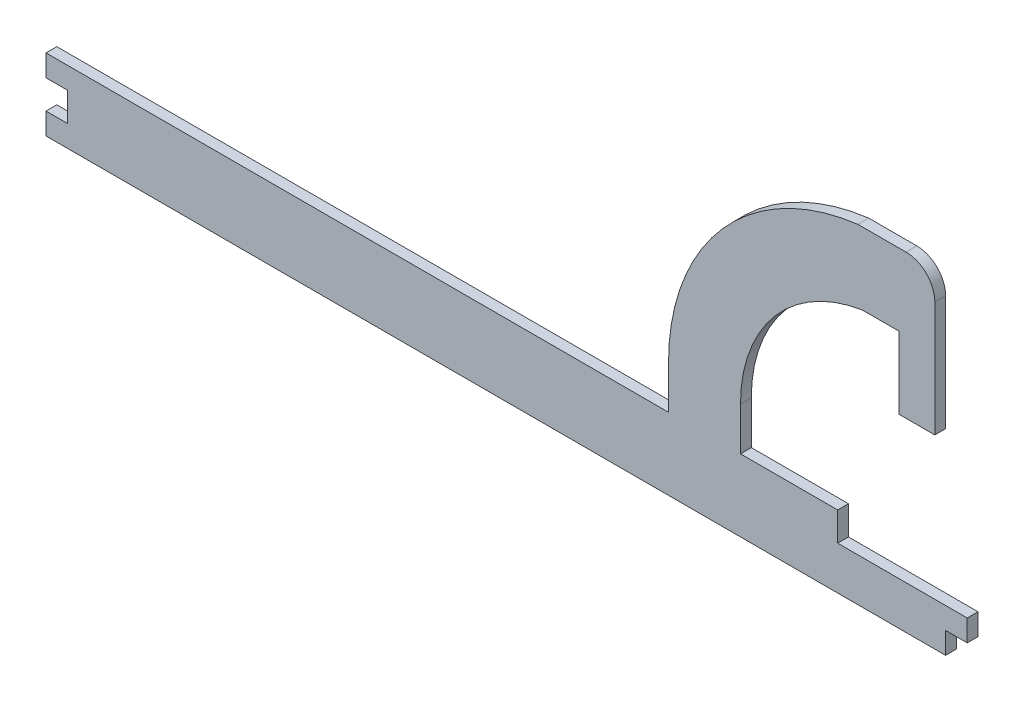
ISO-10303-21;
HEADER;
FILE_DESCRIPTION(('STEP AP214'),'2;1');
FILE_NAME('part.step','',(''),(''),'','','');
FILE_SCHEMA(('AUTOMOTIVE_DESIGN { 1 0 10303 214 1 1 1 1 }'));
ENDSEC;
DATA;
#1=APPLICATION_CONTEXT('core data for automotive mechanical design processes');
#2=APPLICATION_PROTOCOL_DEFINITION('international standard','automotive_design',2000,#1);
#3=PRODUCT_CONTEXT('',#1,'mechanical');
#4=PRODUCT('Part','Part','',(#3));
#5=PRODUCT_RELATED_PRODUCT_CATEGORY('part','',(#4));
#6=PRODUCT_DEFINITION_FORMATION('','',#4);
#7=PRODUCT_DEFINITION_CONTEXT('part definition',#1,'design');
#8=PRODUCT_DEFINITION('design','',#6,#7);
#9=PRODUCT_DEFINITION_SHAPE('','',#8);
#10=(LENGTH_UNIT() NAMED_UNIT(*) SI_UNIT(.MILLI.,.METRE.));
#11=(NAMED_UNIT(*) PLANE_ANGLE_UNIT() SI_UNIT($,.RADIAN.));
#12=(NAMED_UNIT(*) SI_UNIT($,.STERADIAN.) SOLID_ANGLE_UNIT());
#13=UNCERTAINTY_MEASURE_WITH_UNIT(LENGTH_MEASURE(1.E-05),#10,'distance_accuracy_value','');
#14=(GEOMETRIC_REPRESENTATION_CONTEXT(3) GLOBAL_UNCERTAINTY_ASSIGNED_CONTEXT((#13)) GLOBAL_UNIT_ASSIGNED_CONTEXT((#10,
#11,#12)) REPRESENTATION_CONTEXT('',''));
#15=CARTESIAN_POINT('',(0.,0.,0.));
#16=DIRECTION('',(0.,0.,1.));
#17=DIRECTION('',(1.,0.,0.));
#18=AXIS2_PLACEMENT_3D('',#15,#16,#17);
#19=CARTESIAN_POINT('',(0.,0.,3.));
#20=DIRECTION('',(0.,1.,0.));
#21=DIRECTION('',(0.,0.,1.));
#22=AXIS2_PLACEMENT_3D('',#19,#20,#21);
#23=PLANE('',#22);
#24=DIRECTION('',(1.,0.,0.));
#25=VECTOR('',#24,1.);
#26=CARTESIAN_POINT('',(0.,0.,0.));
#27=LINE('',#26,#25);
#28=CARTESIAN_POINT('',(-6.,0.,0.));
#29=VERTEX_POINT('',#28);
#30=CARTESIAN_POINT('',(244.,0.,0.));
#31=VERTEX_POINT('',#30);
#32=EDGE_CURVE('E130',#29,#31,#27,.T.);
#33=ORIENTED_EDGE('',*,*,#32,.T.);
#34=DIRECTION('',(0.,0.,-1.));
#35=VECTOR('',#34,1.);
#36=CARTESIAN_POINT('',(244.,0.,3.));
#37=LINE('',#36,#35);
#38=CARTESIAN_POINT('',(244.,0.,3.));
#39=VERTEX_POINT('',#38);
#40=EDGE_CURVE('E11',#39,#31,#37,.T.);
#41=ORIENTED_EDGE('',*,*,#40,.F.);
#42=DIRECTION('',(1.,0.,0.));
#43=VECTOR('',#42,1.);
#44=CARTESIAN_POINT('',(-6.,0.,3.));
#45=LINE('',#44,#43);
#46=CARTESIAN_POINT('',(-6.,0.,3.));
#47=VERTEX_POINT('',#46);
#48=EDGE_CURVE('E136',#47,#39,#45,.T.);
#49=ORIENTED_EDGE('',*,*,#48,.F.);
#50=DIRECTION('',(0.,0.,-1.));
#51=VECTOR('',#50,1.);
#52=CARTESIAN_POINT('',(-6.,0.,3.));
#53=LINE('',#52,#51);
#54=EDGE_CURVE('E215',#47,#29,#53,.T.);
#55=ORIENTED_EDGE('',*,*,#54,.T.);
#56=EDGE_LOOP('',(#33,#41,#49,#55));
#57=FACE_BOUND('',#56,.T.);
#58=ADVANCED_FACE('F33',(#57),#23,.F.);
#59=CARTESIAN_POINT('',(244.,6.,3.));
#60=DIRECTION('',(-1.,0.,0.));
#61=DIRECTION('',(0.,0.,1.));
#62=AXIS2_PLACEMENT_3D('',#59,#60,#61);
#63=PLANE('',#62);
#64=DIRECTION('',(0.,1.,0.));
#65=VECTOR('',#64,1.);
#66=CARTESIAN_POINT('',(244.,6.,0.));
#67=LINE('',#66,#65);
#68=CARTESIAN_POINT('',(244.,6.,0.));
#69=VERTEX_POINT('',#68);
#70=EDGE_CURVE('E220',#31,#69,#67,.T.);
#71=ORIENTED_EDGE('',*,*,#70,.T.);
#72=DIRECTION('',(0.,0.,-1.));
#73=VECTOR('',#72,1.);
#74=CARTESIAN_POINT('',(244.,6.,3.));
#75=LINE('',#74,#73);
#76=CARTESIAN_POINT('',(244.,6.,3.));
#77=VERTEX_POINT('',#76);
#78=EDGE_CURVE('E41',#77,#69,#75,.T.);
#79=ORIENTED_EDGE('',*,*,#78,.F.);
#80=DIRECTION('',(0.,1.,0.));
#81=VECTOR('',#80,1.);
#82=CARTESIAN_POINT('',(244.,6.,3.));
#83=LINE('',#82,#81);
#84=EDGE_CURVE('E386',#39,#77,#83,.T.);
#85=ORIENTED_EDGE('',*,*,#84,.F.);
#86=ORIENTED_EDGE('',*,*,#40,.T.);
#87=EDGE_LOOP('',(#71,#79,#85,#86));
#88=FACE_BOUND('',#87,.T.);
#89=ADVANCED_FACE('F389',(#88),#63,.F.);
#90=CARTESIAN_POINT('',(250.,6.,3.));
#91=DIRECTION('',(0.,1.,0.));
#92=DIRECTION('',(-1.,0.,0.));
#93=AXIS2_PLACEMENT_3D('',#90,#91,#92);
#94=PLANE('',#93);
#95=DIRECTION('',(1.,0.,0.));
#96=VECTOR('',#95,1.);
#97=CARTESIAN_POINT('',(250.,6.,0.));
#98=LINE('',#97,#96);
#99=CARTESIAN_POINT('',(250.,6.,0.));
#100=VERTEX_POINT('',#99);
#101=EDGE_CURVE('E222',#69,#100,#98,.T.);
#102=ORIENTED_EDGE('',*,*,#101,.T.);
#103=DIRECTION('',(0.,0.,-1.));
#104=VECTOR('',#103,1.);
#105=CARTESIAN_POINT('',(250.,6.,3.));
#106=LINE('',#105,#104);
#107=CARTESIAN_POINT('',(250.,6.,3.));
#108=VERTEX_POINT('',#107);
#109=EDGE_CURVE('E316',#108,#100,#106,.T.);
#110=ORIENTED_EDGE('',*,*,#109,.F.);
#111=DIRECTION('',(1.,0.,0.));
#112=VECTOR('',#111,1.);
#113=CARTESIAN_POINT('',(250.,6.,3.));
#114=LINE('',#113,#112);
#115=EDGE_CURVE('E325',#77,#108,#114,.T.);
#116=ORIENTED_EDGE('',*,*,#115,.F.);
#117=ORIENTED_EDGE('',*,*,#78,.T.);
#118=EDGE_LOOP('',(#102,#110,#116,#117));
#119=FACE_BOUND('',#118,.T.);
#120=ADVANCED_FACE('F323',(#119),#94,.F.);
#121=CARTESIAN_POINT('',(250.,12.,3.));
#122=DIRECTION('',(-1.,0.,0.));
#123=DIRECTION('',(0.,0.,1.));
#124=AXIS2_PLACEMENT_3D('',#121,#122,#123);
#125=PLANE('',#124);
#126=DIRECTION('',(0.,1.,0.));
#127=VECTOR('',#126,1.);
#128=CARTESIAN_POINT('',(250.,12.,0.));
#129=LINE('',#128,#127);
#130=CARTESIAN_POINT('',(250.,12.,0.));
#131=VERTEX_POINT('',#130);
#132=EDGE_CURVE('E224',#100,#131,#129,.T.);
#133=ORIENTED_EDGE('',*,*,#132,.T.);
#134=DIRECTION('',(0.,0.,-1.));
#135=VECTOR('',#134,1.);
#136=CARTESIAN_POINT('',(250.,12.,3.));
#137=LINE('',#136,#135);
#138=CARTESIAN_POINT('',(250.,12.,3.));
#139=VERTEX_POINT('',#138);
#140=EDGE_CURVE('E313',#139,#131,#137,.T.);
#141=ORIENTED_EDGE('',*,*,#140,.F.);
#142=DIRECTION('',(0.,1.,0.));
#143=VECTOR('',#142,1.);
#144=CARTESIAN_POINT('',(250.,12.,3.));
#145=LINE('',#144,#143);
#146=EDGE_CURVE('E342',#108,#139,#145,.T.);
#147=ORIENTED_EDGE('',*,*,#146,.F.);
#148=ORIENTED_EDGE('',*,*,#109,.T.);
#149=EDGE_LOOP('',(#133,#141,#147,#148));
#150=FACE_BOUND('',#149,.T.);
#151=ADVANCED_FACE('F333',(#150),#125,.F.);
#152=CARTESIAN_POINT('',(214.,12.,3.));
#153=DIRECTION('',(0.,-1.,0.));
#154=DIRECTION('',(0.,0.,-1.));
#155=AXIS2_PLACEMENT_3D('',#152,#153,#154);
#156=PLANE('',#155);
#157=DIRECTION('',(-1.,0.,0.));
#158=VECTOR('',#157,1.);
#159=CARTESIAN_POINT('',(214.,12.,0.));
#160=LINE('',#159,#158);
#161=CARTESIAN_POINT('',(214.,12.,0.));
#162=VERTEX_POINT('',#161);
#163=EDGE_CURVE('E227',#131,#162,#160,.T.);
#164=ORIENTED_EDGE('',*,*,#163,.T.);
#165=DIRECTION('',(0.,0.,-1.));
#166=VECTOR('',#165,1.);
#167=CARTESIAN_POINT('',(214.,12.,3.));
#168=LINE('',#167,#166);
#169=CARTESIAN_POINT('',(214.,12.,3.));
#170=VERTEX_POINT('',#169);
#171=EDGE_CURVE('E310',#170,#162,#168,.T.);
#172=ORIENTED_EDGE('',*,*,#171,.F.);
#173=DIRECTION('',(-1.,0.,0.));
#174=VECTOR('',#173,1.);
#175=CARTESIAN_POINT('',(244.,12.,3.));
#176=LINE('',#175,#174);
#177=EDGE_CURVE('E339',#139,#170,#176,.T.);
#178=ORIENTED_EDGE('',*,*,#177,.F.);
#179=ORIENTED_EDGE('',*,*,#140,.T.);
#180=EDGE_LOOP('',(#164,#172,#178,#179));
#181=FACE_BOUND('',#180,.T.);
#182=ADVANCED_FACE('F337',(#181),#156,.F.);
#183=CARTESIAN_POINT('',(214.,20.,3.));
#184=DIRECTION('',(-1.,0.,0.));
#185=DIRECTION('',(0.,0.,1.));
#186=AXIS2_PLACEMENT_3D('',#183,#184,#185);
#187=PLANE('',#186);
#188=DIRECTION('',(0.,1.,0.));
#189=VECTOR('',#188,1.);
#190=CARTESIAN_POINT('',(214.,20.,0.));
#191=LINE('',#190,#189);
#192=CARTESIAN_POINT('',(214.,20.,0.));
#193=VERTEX_POINT('',#192);
#194=EDGE_CURVE('E229',#162,#193,#191,.T.);
#195=ORIENTED_EDGE('',*,*,#194,.T.);
#196=DIRECTION('',(0.,0.,-1.));
#197=VECTOR('',#196,1.);
#198=CARTESIAN_POINT('',(214.,20.,3.));
#199=LINE('',#198,#197);
#200=CARTESIAN_POINT('',(214.,20.,3.));
#201=VERTEX_POINT('',#200);
#202=EDGE_CURVE('E307',#201,#193,#199,.T.);
#203=ORIENTED_EDGE('',*,*,#202,.F.);
#204=DIRECTION('',(0.,1.,0.));
#205=VECTOR('',#204,1.);
#206=CARTESIAN_POINT('',(214.,20.,3.));
#207=LINE('',#206,#205);
#208=EDGE_CURVE('E341',#170,#201,#207,.T.);
#209=ORIENTED_EDGE('',*,*,#208,.F.);
#210=ORIENTED_EDGE('',*,*,#171,.T.);
#211=EDGE_LOOP('',(#195,#203,#209,#210));
#212=FACE_BOUND('',#211,.T.);
#213=ADVANCED_FACE('F401',(#212),#187,.F.);
#214=CARTESIAN_POINT('',(187.,20.,3.));
#215=DIRECTION('',(0.,-1.,0.));
#216=DIRECTION('',(0.,0.,-1.));
#217=AXIS2_PLACEMENT_3D('',#214,#215,#216);
#218=PLANE('',#217);
#219=DIRECTION('',(-1.,0.,0.));
#220=VECTOR('',#219,1.);
#221=CARTESIAN_POINT('',(187.,20.,0.));
#222=LINE('',#221,#220);
#223=CARTESIAN_POINT('',(187.,20.,0.));
#224=VERTEX_POINT('',#223);
#225=EDGE_CURVE('E231',#193,#224,#222,.T.);
#226=ORIENTED_EDGE('',*,*,#225,.T.);
#227=DIRECTION('',(0.,0.,-1.));
#228=VECTOR('',#227,1.);
#229=CARTESIAN_POINT('',(187.,20.,3.));
#230=LINE('',#229,#228);
#231=CARTESIAN_POINT('',(187.,20.,3.));
#232=VERTEX_POINT('',#231);
#233=EDGE_CURVE('E304',#232,#224,#230,.T.);
#234=ORIENTED_EDGE('',*,*,#233,.F.);
#235=DIRECTION('',(-1.,0.,0.));
#236=VECTOR('',#235,1.);
#237=CARTESIAN_POINT('',(187.,20.,3.));
#238=LINE('',#237,#236);
#239=EDGE_CURVE('E344',#201,#232,#238,.T.);
#240=ORIENTED_EDGE('',*,*,#239,.F.);
#241=ORIENTED_EDGE('',*,*,#202,.T.);
#242=EDGE_LOOP('',(#226,#234,#240,#241));
#243=FACE_BOUND('',#242,.T.);
#244=ADVANCED_FACE('F404',(#243),#218,.F.);
#245=CARTESIAN_POINT('',(187.,20.,3.));
#246=DIRECTION('',(-1.,0.,0.));
#247=DIRECTION('',(0.,0.,1.));
#248=AXIS2_PLACEMENT_3D('',#245,#246,#247);
#249=PLANE('',#248);
#250=DIRECTION('',(0.,1.,0.));
#251=VECTOR('',#250,1.);
#252=CARTESIAN_POINT('',(187.,20.,0.));
#253=LINE('',#252,#251);
#254=CARTESIAN_POINT('',(187.,32.,0.));
#255=VERTEX_POINT('',#254);
#256=EDGE_CURVE('E233',#224,#255,#253,.T.);
#257=ORIENTED_EDGE('',*,*,#256,.T.);
#258=DIRECTION('',(0.,0.,-1.));
#259=VECTOR('',#258,1.);
#260=CARTESIAN_POINT('',(187.,32.,3.));
#261=LINE('',#260,#259);
#262=CARTESIAN_POINT('',(187.,32.,3.));
#263=VERTEX_POINT('',#262);
#264=EDGE_CURVE('E301',#263,#255,#261,.T.);
#265=ORIENTED_EDGE('',*,*,#264,.F.);
#266=DIRECTION('',(0.,1.,0.));
#267=VECTOR('',#266,1.);
#268=CARTESIAN_POINT('',(187.,20.,3.));
#269=LINE('',#268,#267);
#270=EDGE_CURVE('E350',#232,#263,#269,.T.);
#271=ORIENTED_EDGE('',*,*,#270,.F.);
#272=ORIENTED_EDGE('',*,*,#233,.T.);
#273=EDGE_LOOP('',(#257,#265,#271,#272));
#274=FACE_BOUND('',#273,.T.);
#275=ADVANCED_FACE('F408',(#274),#249,.F.);
#276=CARTESIAN_POINT('',(227.,32.,3.));
#277=DIRECTION('',(0.,0.,-1.));
#278=DIRECTION('',(-1.,0.,0.));
#279=AXIS2_PLACEMENT_3D('',#276,#277,#278);
#280=CYLINDRICAL_SURFACE('',#279,40.);
#281=CARTESIAN_POINT('',(227.,32.,0.));
#282=DIRECTION('',(0.,0.,-1.));
#283=DIRECTION('',(1.,0.,0.));
#284=AXIS2_PLACEMENT_3D('',#281,#282,#283);
#285=CIRCLE('',#284,40.);
#286=CARTESIAN_POINT('',(221.,71.5474398665704,0.));
#287=VERTEX_POINT('',#286);
#288=EDGE_CURVE('E235',#255,#287,#285,.T.);
#289=ORIENTED_EDGE('',*,*,#288,.T.);
#290=DIRECTION('',(0.,0.,-1.));
#291=VECTOR('',#290,1.);
#292=CARTESIAN_POINT('',(221.,71.5474398665704,3.));
#293=LINE('',#292,#291);
#294=CARTESIAN_POINT('',(221.,71.5474398665704,3.));
#295=VERTEX_POINT('',#294);
#296=EDGE_CURVE('E298',#295,#287,#293,.T.);
#297=ORIENTED_EDGE('',*,*,#296,.F.);
#298=CARTESIAN_POINT('',(227.,32.,3.));
#299=DIRECTION('',(0.,0.,-1.));
#300=DIRECTION('',(1.,0.,0.));
#301=AXIS2_PLACEMENT_3D('',#298,#299,#300);
#302=CIRCLE('',#301,40.);
#303=EDGE_CURVE('E352',#263,#295,#302,.T.);
#304=ORIENTED_EDGE('',*,*,#303,.F.);
#305=ORIENTED_EDGE('',*,*,#264,.T.);
#306=EDGE_LOOP('',(#289,#297,#304,#305));
#307=FACE_BOUND('',#306,.T.);
#308=ADVANCED_FACE('F412',(#307),#280,.F.);
#309=CARTESIAN_POINT('',(231.,71.5474398665704,3.));
#310=DIRECTION('',(0.,1.,0.));
#311=DIRECTION('',(0.,0.,1.));
#312=AXIS2_PLACEMENT_3D('',#309,#310,#311);
#313=PLANE('',#312);
#314=DIRECTION('',(1.,0.,0.));
#315=VECTOR('',#314,1.);
#316=CARTESIAN_POINT('',(231.,71.5474398665704,0.));
#317=LINE('',#316,#315);
#318=CARTESIAN_POINT('',(231.,71.5474398665704,0.));
#319=VERTEX_POINT('',#318);
#320=EDGE_CURVE('E237',#287,#319,#317,.T.);
#321=ORIENTED_EDGE('',*,*,#320,.T.);
#322=DIRECTION('',(0.,0.,-1.));
#323=VECTOR('',#322,1.);
#324=CARTESIAN_POINT('',(231.,71.5474398665704,3.));
#325=LINE('',#324,#323);
#326=CARTESIAN_POINT('',(231.,71.5474398665704,3.));
#327=VERTEX_POINT('',#326);
#328=EDGE_CURVE('E295',#327,#319,#325,.T.);
#329=ORIENTED_EDGE('',*,*,#328,.F.);
#330=DIRECTION('',(1.,0.,0.));
#331=VECTOR('',#330,1.);
#332=CARTESIAN_POINT('',(231.,71.5474398665704,3.));
#333=LINE('',#332,#331);
#334=EDGE_CURVE('E354',#295,#327,#333,.T.);
#335=ORIENTED_EDGE('',*,*,#334,.F.);
#336=ORIENTED_EDGE('',*,*,#296,.T.);
#337=EDGE_LOOP('',(#321,#329,#335,#336));
#338=FACE_BOUND('',#337,.T.);
#339=ADVANCED_FACE('F416',(#338),#313,.F.);
#340=CARTESIAN_POINT('',(231.,71.5474398665704,3.));
#341=DIRECTION('',(1.,0.,0.));
#342=DIRECTION('',(0.,0.,-1.));
#343=AXIS2_PLACEMENT_3D('',#340,#341,#342);
#344=PLANE('',#343);
#345=DIRECTION('',(0.,-1.,0.));
#346=VECTOR('',#345,1.);
#347=CARTESIAN_POINT('',(231.,71.5474398665704,0.));
#348=LINE('',#347,#346);
#349=CARTESIAN_POINT('',(231.,51.5474398665704,0.));
#350=VERTEX_POINT('',#349);
#351=EDGE_CURVE('E239',#319,#350,#348,.T.);
#352=ORIENTED_EDGE('',*,*,#351,.T.);
#353=DIRECTION('',(0.,0.,-1.));
#354=VECTOR('',#353,1.);
#355=CARTESIAN_POINT('',(231.,51.5474398665704,3.));
#356=LINE('',#355,#354);
#357=CARTESIAN_POINT('',(231.,51.5474398665704,3.));
#358=VERTEX_POINT('',#357);
#359=EDGE_CURVE('E292',#358,#350,#356,.T.);
#360=ORIENTED_EDGE('',*,*,#359,.F.);
#361=DIRECTION('',(0.,-1.,0.));
#362=VECTOR('',#361,1.);
#363=CARTESIAN_POINT('',(231.,71.5474398665704,3.));
#364=LINE('',#363,#362);
#365=EDGE_CURVE('E356',#327,#358,#364,.T.);
#366=ORIENTED_EDGE('',*,*,#365,.F.);
#367=ORIENTED_EDGE('',*,*,#328,.T.);
#368=EDGE_LOOP('',(#352,#360,#366,#367));
#369=FACE_BOUND('',#368,.T.);
#370=ADVANCED_FACE('F420',(#369),#344,.F.);
#371=CARTESIAN_POINT('',(231.,51.5474398665704,3.));
#372=DIRECTION('',(0.,1.,0.));
#373=DIRECTION('',(0.,0.,1.));
#374=AXIS2_PLACEMENT_3D('',#371,#372,#373);
#375=PLANE('',#374);
#376=DIRECTION('',(1.,0.,0.));
#377=VECTOR('',#376,1.);
#378=CARTESIAN_POINT('',(231.,51.5474398665704,0.));
#379=LINE('',#378,#377);
#380=CARTESIAN_POINT('',(241.,51.5474398665704,0.));
#381=VERTEX_POINT('',#380);
#382=EDGE_CURVE('E241',#350,#381,#379,.T.);
#383=ORIENTED_EDGE('',*,*,#382,.T.);
#384=DIRECTION('',(0.,0.,-1.));
#385=VECTOR('',#384,1.);
#386=CARTESIAN_POINT('',(241.,51.5474398665704,3.));
#387=LINE('',#386,#385);
#388=CARTESIAN_POINT('',(241.,51.5474398665704,3.));
#389=VERTEX_POINT('',#388);
#390=EDGE_CURVE('E289',#389,#381,#387,.T.);
#391=ORIENTED_EDGE('',*,*,#390,.F.);
#392=DIRECTION('',(1.,0.,0.));
#393=VECTOR('',#392,1.);
#394=CARTESIAN_POINT('',(231.,51.5474398665704,3.));
#395=LINE('',#394,#393);
#396=EDGE_CURVE('E358',#358,#389,#395,.T.);
#397=ORIENTED_EDGE('',*,*,#396,.F.);
#398=ORIENTED_EDGE('',*,*,#359,.T.);
#399=EDGE_LOOP('',(#383,#391,#397,#398));
#400=FACE_BOUND('',#399,.T.);
#401=ADVANCED_FACE('F424',(#400),#375,.F.);
#402=CARTESIAN_POINT('',(241.,83.5474398665704,3.));
#403=DIRECTION('',(-1.,0.,0.));
#404=DIRECTION('',(0.,0.,1.));
#405=AXIS2_PLACEMENT_3D('',#402,#403,#404);
#406=PLANE('',#405);
#407=DIRECTION('',(0.,1.,0.));
#408=VECTOR('',#407,1.);
#409=CARTESIAN_POINT('',(241.,83.5474398665704,0.));
#410=LINE('',#409,#408);
#411=CARTESIAN_POINT('',(241.,83.5474398665704,0.));
#412=VERTEX_POINT('',#411);
#413=EDGE_CURVE('E243',#381,#412,#410,.T.);
#414=ORIENTED_EDGE('',*,*,#413,.T.);
#415=DIRECTION('',(0.,0.,-1.));
#416=VECTOR('',#415,1.);
#417=CARTESIAN_POINT('',(241.,83.5474398665704,3.));
#418=LINE('',#417,#416);
#419=CARTESIAN_POINT('',(241.,83.5474398665704,3.));
#420=VERTEX_POINT('',#419);
#421=EDGE_CURVE('E286',#420,#412,#418,.T.);
#422=ORIENTED_EDGE('',*,*,#421,.F.);
#423=DIRECTION('',(0.,1.,0.));
#424=VECTOR('',#423,1.);
#425=CARTESIAN_POINT('',(241.,83.5474398665704,3.));
#426=LINE('',#425,#424);
#427=EDGE_CURVE('E360',#389,#420,#426,.T.);
#428=ORIENTED_EDGE('',*,*,#427,.F.);
#429=ORIENTED_EDGE('',*,*,#390,.T.);
#430=EDGE_LOOP('',(#414,#422,#428,#429));
#431=FACE_BOUND('',#430,.T.);
#432=ADVANCED_FACE('F428',(#431),#406,.F.);
#433=CARTESIAN_POINT('',(233.,83.5474398665704,3.));
#434=DIRECTION('',(0.,0.,-1.));
#435=DIRECTION('',(-1.,0.,0.));
#436=AXIS2_PLACEMENT_3D('',#433,#434,#435);
#437=CYLINDRICAL_SURFACE('',#436,8.00000000000001);
#438=CARTESIAN_POINT('',(233.,83.5474398665704,0.));
#439=DIRECTION('',(0.,0.,1.));
#440=DIRECTION('',(1.,0.,0.));
#441=AXIS2_PLACEMENT_3D('',#438,#439,#440);
#442=CIRCLE('',#441,8.00000000000001);
#443=CARTESIAN_POINT('',(233.,91.5474398665704,0.));
#444=VERTEX_POINT('',#443);
#445=EDGE_CURVE('E245',#412,#444,#442,.T.);
#446=ORIENTED_EDGE('',*,*,#445,.T.);
#447=DIRECTION('',(0.,0.,-1.));
#448=VECTOR('',#447,1.);
#449=CARTESIAN_POINT('',(233.,91.5474398665704,3.));
#450=LINE('',#449,#448);
#451=CARTESIAN_POINT('',(233.,91.5474398665704,3.));
#452=VERTEX_POINT('',#451);
#453=EDGE_CURVE('E283',#452,#444,#450,.T.);
#454=ORIENTED_EDGE('',*,*,#453,.F.);
#455=CARTESIAN_POINT('',(233.,83.5474398665704,3.));
#456=DIRECTION('',(0.,0.,1.));
#457=DIRECTION('',(1.,0.,0.));
#458=AXIS2_PLACEMENT_3D('',#455,#456,#457);
#459=CIRCLE('',#458,8.00000000000001);
#460=EDGE_CURVE('E362',#420,#452,#459,.T.);
#461=ORIENTED_EDGE('',*,*,#460,.F.);
#462=ORIENTED_EDGE('',*,*,#421,.T.);
#463=EDGE_LOOP('',(#446,#454,#461,#462));
#464=FACE_BOUND('',#463,.T.);
#465=ADVANCED_FACE('F432',(#464),#437,.T.);
#466=CARTESIAN_POINT('',(233.,91.5474398665704,3.));
#467=DIRECTION('',(0.,-1.,0.));
#468=DIRECTION('',(0.,0.,-1.));
#469=AXIS2_PLACEMENT_3D('',#466,#467,#468);
#470=PLANE('',#469);
#471=DIRECTION('',(-1.,0.,0.));
#472=VECTOR('',#471,1.);
#473=CARTESIAN_POINT('',(233.,91.5474398665704,0.));
#474=LINE('',#473,#472);
#475=CARTESIAN_POINT('',(219.644566271308,91.5474398665704,0.));
#476=VERTEX_POINT('',#475);
#477=EDGE_CURVE('E247',#444,#476,#474,.T.);
#478=ORIENTED_EDGE('',*,*,#477,.T.);
#479=DIRECTION('',(0.,0.,-1.));
#480=VECTOR('',#479,1.);
#481=CARTESIAN_POINT('',(219.644566271308,91.5474398665704,3.));
#482=LINE('',#481,#480);
#483=CARTESIAN_POINT('',(219.644566271308,91.5474398665704,3.));
#484=VERTEX_POINT('',#483);
#485=EDGE_CURVE('E280',#484,#476,#482,.T.);
#486=ORIENTED_EDGE('',*,*,#485,.F.);
#487=DIRECTION('',(-1.,0.,0.));
#488=VECTOR('',#487,1.);
#489=CARTESIAN_POINT('',(233.,91.5474398665704,3.));
#490=LINE('',#489,#488);
#491=EDGE_CURVE('E364',#452,#484,#490,.T.);
#492=ORIENTED_EDGE('',*,*,#491,.F.);
#493=ORIENTED_EDGE('',*,*,#453,.T.);
#494=EDGE_LOOP('',(#478,#486,#492,#493));
#495=FACE_BOUND('',#494,.T.);
#496=ADVANCED_FACE('F436',(#495),#470,.F.);
#497=CARTESIAN_POINT('',(227.,32.,3.));
#498=DIRECTION('',(0.,0.,-1.));
#499=DIRECTION('',(-1.,0.,0.));
#500=AXIS2_PLACEMENT_3D('',#497,#498,#499);
#501=CYLINDRICAL_SURFACE('',#500,60.);
#502=CARTESIAN_POINT('',(227.,32.,0.));
#503=DIRECTION('',(0.,0.,1.));
#504=DIRECTION('',(1.,0.,0.));
#505=AXIS2_PLACEMENT_3D('',#502,#503,#504);
#506=CIRCLE('',#505,60.);
#507=CARTESIAN_POINT('',(167.,32.,0.));
#508=VERTEX_POINT('',#507);
#509=EDGE_CURVE('E249',#476,#508,#506,.T.);
#510=ORIENTED_EDGE('',*,*,#509,.T.);
#511=DIRECTION('',(0.,0.,-1.));
#512=VECTOR('',#511,1.);
#513=CARTESIAN_POINT('',(167.,32.,3.));
#514=LINE('',#513,#512);
#515=CARTESIAN_POINT('',(167.,32.,3.));
#516=VERTEX_POINT('',#515);
#517=EDGE_CURVE('E277',#516,#508,#514,.T.);
#518=ORIENTED_EDGE('',*,*,#517,.F.);
#519=CARTESIAN_POINT('',(227.,32.,3.));
#520=DIRECTION('',(0.,0.,1.));
#521=DIRECTION('',(1.,0.,0.));
#522=AXIS2_PLACEMENT_3D('',#519,#520,#521);
#523=CIRCLE('',#522,60.);
#524=EDGE_CURVE('E366',#484,#516,#523,.T.);
#525=ORIENTED_EDGE('',*,*,#524,.F.);
#526=ORIENTED_EDGE('',*,*,#485,.T.);
#527=EDGE_LOOP('',(#510,#518,#525,#526));
#528=FACE_BOUND('',#527,.T.);
#529=ADVANCED_FACE('F440',(#528),#501,.T.);
#530=CARTESIAN_POINT('',(167.,32.,3.));
#531=DIRECTION('',(1.,0.,0.));
#532=DIRECTION('',(0.,0.,-1.));
#533=AXIS2_PLACEMENT_3D('',#530,#531,#532);
#534=PLANE('',#533);
#535=DIRECTION('',(0.,-1.,0.));
#536=VECTOR('',#535,1.);
#537=CARTESIAN_POINT('',(167.,32.,0.));
#538=LINE('',#537,#536);
#539=CARTESIAN_POINT('',(167.,20.,0.));
#540=VERTEX_POINT('',#539);
#541=EDGE_CURVE('E251',#508,#540,#538,.T.);
#542=ORIENTED_EDGE('',*,*,#541,.T.);
#543=DIRECTION('',(0.,0.,-1.));
#544=VECTOR('',#543,1.);
#545=CARTESIAN_POINT('',(167.,20.,3.));
#546=LINE('',#545,#544);
#547=CARTESIAN_POINT('',(167.,20.,3.));
#548=VERTEX_POINT('',#547);
#549=EDGE_CURVE('E274',#548,#540,#546,.T.);
#550=ORIENTED_EDGE('',*,*,#549,.F.);
#551=DIRECTION('',(0.,-1.,0.));
#552=VECTOR('',#551,1.);
#553=CARTESIAN_POINT('',(167.,32.,3.));
#554=LINE('',#553,#552);
#555=EDGE_CURVE('E368',#516,#548,#554,.T.);
#556=ORIENTED_EDGE('',*,*,#555,.F.);
#557=ORIENTED_EDGE('',*,*,#517,.T.);
#558=EDGE_LOOP('',(#542,#550,#556,#557));
#559=FACE_BOUND('',#558,.T.);
#560=ADVANCED_FACE('F444',(#559),#534,.F.);
#561=CARTESIAN_POINT('',(0.,20.,3.));
#562=DIRECTION('',(0.,-1.,0.));
#563=DIRECTION('',(0.,0.,-1.));
#564=AXIS2_PLACEMENT_3D('',#561,#562,#563);
#565=PLANE('',#564);
#566=DIRECTION('',(-1.,0.,0.));
#567=VECTOR('',#566,1.);
#568=CARTESIAN_POINT('',(0.,20.,0.));
#569=LINE('',#568,#567);
#570=CARTESIAN_POINT('',(-6.,20.,0.));
#571=VERTEX_POINT('',#570);
#572=EDGE_CURVE('E254',#540,#571,#569,.T.);
#573=ORIENTED_EDGE('',*,*,#572,.T.);
#574=DIRECTION('',(0.,0.,-1.));
#575=VECTOR('',#574,1.);
#576=CARTESIAN_POINT('',(-6.,20.,3.));
#577=LINE('',#576,#575);
#578=CARTESIAN_POINT('',(-6.,20.,3.));
#579=VERTEX_POINT('',#578);
#580=EDGE_CURVE('E271',#579,#571,#577,.T.);
#581=ORIENTED_EDGE('',*,*,#580,.F.);
#582=DIRECTION('',(-1.,0.,0.));
#583=VECTOR('',#582,1.);
#584=CARTESIAN_POINT('',(0.,20.,3.));
#585=LINE('',#584,#583);
#586=EDGE_CURVE('E370',#548,#579,#585,.T.);
#587=ORIENTED_EDGE('',*,*,#586,.F.);
#588=ORIENTED_EDGE('',*,*,#549,.T.);
#589=EDGE_LOOP('',(#573,#581,#587,#588));
#590=FACE_BOUND('',#589,.T.);
#591=ADVANCED_FACE('F448',(#590),#565,.F.);
#592=CARTESIAN_POINT('',(-6.,20.,3.));
#593=DIRECTION('',(1.,0.,0.));
#594=DIRECTION('',(0.,0.,-1.));
#595=AXIS2_PLACEMENT_3D('',#592,#593,#594);
#596=PLANE('',#595);
#597=DIRECTION('',(0.,-1.,0.));
#598=VECTOR('',#597,1.);
#599=CARTESIAN_POINT('',(-6.,20.,0.));
#600=LINE('',#599,#598);
#601=CARTESIAN_POINT('',(-6.,14.,0.));
#602=VERTEX_POINT('',#601);
#603=EDGE_CURVE('E256',#571,#602,#600,.T.);
#604=ORIENTED_EDGE('',*,*,#603,.T.);
#605=DIRECTION('',(0.,0.,-1.));
#606=VECTOR('',#605,1.);
#607=CARTESIAN_POINT('',(-6.,14.,3.));
#608=LINE('',#607,#606);
#609=CARTESIAN_POINT('',(-6.,14.,3.));
#610=VERTEX_POINT('',#609);
#611=EDGE_CURVE('E268',#610,#602,#608,.T.);
#612=ORIENTED_EDGE('',*,*,#611,.F.);
#613=DIRECTION('',(0.,-1.,0.));
#614=VECTOR('',#613,1.);
#615=CARTESIAN_POINT('',(-6.,20.,3.));
#616=LINE('',#615,#614);
#617=EDGE_CURVE('E372',#579,#610,#616,.T.);
#618=ORIENTED_EDGE('',*,*,#617,.F.);
#619=ORIENTED_EDGE('',*,*,#580,.T.);
#620=EDGE_LOOP('',(#604,#612,#618,#619));
#621=FACE_BOUND('',#620,.T.);
#622=ADVANCED_FACE('F378',(#621),#596,.F.);
#623=CARTESIAN_POINT('',(-6.,14.,3.));
#624=DIRECTION('',(0.,1.,0.));
#625=DIRECTION('',(0.,0.,1.));
#626=AXIS2_PLACEMENT_3D('',#623,#624,#625);
#627=PLANE('',#626);
#628=DIRECTION('',(1.,0.,0.));
#629=VECTOR('',#628,1.);
#630=CARTESIAN_POINT('',(-6.,14.,0.));
#631=LINE('',#630,#629);
#632=CARTESIAN_POINT('',(0.,14.,0.));
#633=VERTEX_POINT('',#632);
#634=EDGE_CURVE('E258',#602,#633,#631,.T.);
#635=ORIENTED_EDGE('',*,*,#634,.T.);
#636=DIRECTION('',(0.,0.,-1.));
#637=VECTOR('',#636,1.);
#638=CARTESIAN_POINT('',(0.,14.,3.));
#639=LINE('',#638,#637);
#640=CARTESIAN_POINT('',(0.,14.,3.));
#641=VERTEX_POINT('',#640);
#642=EDGE_CURVE('E210',#641,#633,#639,.T.);
#643=ORIENTED_EDGE('',*,*,#642,.F.);
#644=DIRECTION('',(1.,0.,0.));
#645=VECTOR('',#644,1.);
#646=CARTESIAN_POINT('',(-6.,14.,3.));
#647=LINE('',#646,#645);
#648=EDGE_CURVE('E201',#610,#641,#647,.T.);
#649=ORIENTED_EDGE('',*,*,#648,.F.);
#650=ORIENTED_EDGE('',*,*,#611,.T.);
#651=EDGE_LOOP('',(#635,#643,#649,#650));
#652=FACE_BOUND('',#651,.T.);
#653=ADVANCED_FACE('F382',(#652),#627,.F.);
#654=CARTESIAN_POINT('',(0.,14.,3.));
#655=DIRECTION('',(1.,0.,0.));
#656=DIRECTION('',(0.,1.,0.));
#657=AXIS2_PLACEMENT_3D('',#654,#655,#656);
#658=PLANE('',#657);
#659=DIRECTION('',(0.,-1.,0.));
#660=VECTOR('',#659,1.);
#661=CARTESIAN_POINT('',(0.,14.,0.));
#662=LINE('',#661,#660);
#663=CARTESIAN_POINT('',(0.,6.,0.));
#664=VERTEX_POINT('',#663);
#665=EDGE_CURVE('E209',#633,#664,#662,.T.);
#666=ORIENTED_EDGE('',*,*,#665,.T.);
#667=DIRECTION('',(0.,0.,-1.));
#668=VECTOR('',#667,1.);
#669=CARTESIAN_POINT('',(0.,6.,3.));
#670=LINE('',#669,#668);
#671=CARTESIAN_POINT('',(0.,6.,3.));
#672=VERTEX_POINT('',#671);
#673=EDGE_CURVE('E206',#672,#664,#670,.T.);
#674=ORIENTED_EDGE('',*,*,#673,.F.);
#675=DIRECTION('',(0.,-1.,0.));
#676=VECTOR('',#675,1.);
#677=CARTESIAN_POINT('',(0.,14.,3.));
#678=LINE('',#677,#676);
#679=EDGE_CURVE('E195',#641,#672,#678,.T.);
#680=ORIENTED_EDGE('',*,*,#679,.F.);
#681=ORIENTED_EDGE('',*,*,#642,.T.);
#682=EDGE_LOOP('',(#666,#674,#680,#681));
#683=FACE_BOUND('',#682,.T.);
#684=ADVANCED_FACE('F207',(#683),#658,.F.);
#685=CARTESIAN_POINT('',(0.,6.,3.));
#686=DIRECTION('',(0.,-1.,0.));
#687=DIRECTION('',(0.,0.,-1.));
#688=AXIS2_PLACEMENT_3D('',#685,#686,#687);
#689=PLANE('',#688);
#690=DIRECTION('',(-1.,0.,0.));
#691=VECTOR('',#690,1.);
#692=CARTESIAN_POINT('',(0.,6.,0.));
#693=LINE('',#692,#691);
#694=CARTESIAN_POINT('',(-6.,6.,0.));
#695=VERTEX_POINT('',#694);
#696=EDGE_CURVE('E123',#664,#695,#693,.T.);
#697=ORIENTED_EDGE('',*,*,#696,.T.);
#698=DIRECTION('',(0.,0.,-1.));
#699=VECTOR('',#698,1.);
#700=CARTESIAN_POINT('',(-6.,6.,3.));
#701=LINE('',#700,#699);
#702=CARTESIAN_POINT('',(-6.,6.,3.));
#703=VERTEX_POINT('',#702);
#704=EDGE_CURVE('E211',#703,#695,#701,.T.);
#705=ORIENTED_EDGE('',*,*,#704,.F.);
#706=DIRECTION('',(-1.,0.,0.));
#707=VECTOR('',#706,1.);
#708=CARTESIAN_POINT('',(0.,6.,3.));
#709=LINE('',#708,#707);
#710=EDGE_CURVE('E199',#672,#703,#709,.T.);
#711=ORIENTED_EDGE('',*,*,#710,.F.);
#712=ORIENTED_EDGE('',*,*,#673,.T.);
#713=EDGE_LOOP('',(#697,#705,#711,#712));
#714=FACE_BOUND('',#713,.T.);
#715=ADVANCED_FACE('F213',(#714),#689,.F.);
#716=CARTESIAN_POINT('',(-6.,6.,3.));
#717=DIRECTION('',(1.,0.,0.));
#718=DIRECTION('',(0.,1.,0.));
#719=AXIS2_PLACEMENT_3D('',#716,#717,#718);
#720=PLANE('',#719);
#721=DIRECTION('',(0.,-1.,0.));
#722=VECTOR('',#721,1.);
#723=CARTESIAN_POINT('',(-6.,6.,0.));
#724=LINE('',#723,#722);
#725=EDGE_CURVE('E262',#695,#29,#724,.T.);
#726=ORIENTED_EDGE('',*,*,#725,.T.);
#727=ORIENTED_EDGE('',*,*,#54,.F.);
#728=DIRECTION('',(0.,-1.,0.));
#729=VECTOR('',#728,1.);
#730=CARTESIAN_POINT('',(-6.,6.,3.));
#731=LINE('',#730,#729);
#732=EDGE_CURVE('E49',#703,#47,#731,.T.);
#733=ORIENTED_EDGE('',*,*,#732,.F.);
#734=ORIENTED_EDGE('',*,*,#704,.T.);
#735=EDGE_LOOP('',(#726,#727,#733,#734));
#736=FACE_BOUND('',#735,.T.);
#737=ADVANCED_FACE('F384',(#736),#720,.F.);
#738=CARTESIAN_POINT('',(227.,32.,3.));
#739=DIRECTION('',(0.,0.,1.));
#740=DIRECTION('',(1.,0.,0.));
#741=AXIS2_PLACEMENT_3D('',#738,#739,#740);
#742=PLANE('',#741);
#743=ORIENTED_EDGE('',*,*,#48,.T.);
#744=ORIENTED_EDGE('',*,*,#84,.T.);
#745=ORIENTED_EDGE('',*,*,#115,.T.);
#746=ORIENTED_EDGE('',*,*,#146,.T.);
#747=ORIENTED_EDGE('',*,*,#177,.T.);
#748=ORIENTED_EDGE('',*,*,#208,.T.);
#749=ORIENTED_EDGE('',*,*,#239,.T.);
#750=ORIENTED_EDGE('',*,*,#270,.T.);
#751=ORIENTED_EDGE('',*,*,#303,.T.);
#752=ORIENTED_EDGE('',*,*,#334,.T.);
#753=ORIENTED_EDGE('',*,*,#365,.T.);
#754=ORIENTED_EDGE('',*,*,#396,.T.);
#755=ORIENTED_EDGE('',*,*,#427,.T.);
#756=ORIENTED_EDGE('',*,*,#460,.T.);
#757=ORIENTED_EDGE('',*,*,#491,.T.);
#758=ORIENTED_EDGE('',*,*,#524,.T.);
#759=ORIENTED_EDGE('',*,*,#555,.T.);
#760=ORIENTED_EDGE('',*,*,#586,.T.);
#761=ORIENTED_EDGE('',*,*,#617,.T.);
#762=ORIENTED_EDGE('',*,*,#648,.T.);
#763=ORIENTED_EDGE('',*,*,#679,.T.);
#764=ORIENTED_EDGE('',*,*,#710,.T.);
#765=ORIENTED_EDGE('',*,*,#732,.T.);
#766=EDGE_LOOP('',(#743,#744,#745,#746,#747,#748,#749,#750,#751,#752,#753,#754,#755,#756,#757,
#758,#759,#760,#761,#762,#763,#764,#765));
#767=FACE_BOUND('',#766,.T.);
#768=ADVANCED_FACE('F197',(#767),#742,.T.);
#769=CARTESIAN_POINT('',(227.,32.,0.));
#770=DIRECTION('',(0.,0.,1.));
#771=DIRECTION('',(1.,0.,0.));
#772=AXIS2_PLACEMENT_3D('',#769,#770,#771);
#773=PLANE('',#772);
#774=ORIENTED_EDGE('',*,*,#32,.F.);
#775=ORIENTED_EDGE('',*,*,#725,.F.);
#776=ORIENTED_EDGE('',*,*,#696,.F.);
#777=ORIENTED_EDGE('',*,*,#665,.F.);
#778=ORIENTED_EDGE('',*,*,#634,.F.);
#779=ORIENTED_EDGE('',*,*,#603,.F.);
#780=ORIENTED_EDGE('',*,*,#572,.F.);
#781=ORIENTED_EDGE('',*,*,#541,.F.);
#782=ORIENTED_EDGE('',*,*,#509,.F.);
#783=ORIENTED_EDGE('',*,*,#477,.F.);
#784=ORIENTED_EDGE('',*,*,#445,.F.);
#785=ORIENTED_EDGE('',*,*,#413,.F.);
#786=ORIENTED_EDGE('',*,*,#382,.F.);
#787=ORIENTED_EDGE('',*,*,#351,.F.);
#788=ORIENTED_EDGE('',*,*,#320,.F.);
#789=ORIENTED_EDGE('',*,*,#288,.F.);
#790=ORIENTED_EDGE('',*,*,#256,.F.);
#791=ORIENTED_EDGE('',*,*,#225,.F.);
#792=ORIENTED_EDGE('',*,*,#194,.F.);
#793=ORIENTED_EDGE('',*,*,#163,.F.);
#794=ORIENTED_EDGE('',*,*,#132,.F.);
#795=ORIENTED_EDGE('',*,*,#101,.F.);
#796=ORIENTED_EDGE('',*,*,#70,.F.);
#797=EDGE_LOOP('',(#774,#775,#776,#777,#778,#779,#780,#781,#782,#783,#784,#785,#786,#787,#788,
#789,#790,#791,#792,#793,#794,#795,#796));
#798=FACE_BOUND('',#797,.T.);
#799=ADVANCED_FACE('F329',(#798),#773,.F.);
#800=CLOSED_SHELL('',(#58,#89,#120,#151,#182,#213,#244,#275,#308,#339,#370,#401,#432,#465,#496,
#529,#560,#591,#622,#653,#684,#715,#737,#768,#799));
#801=MANIFOLD_SOLID_BREP('B2',#800);
#802=ADVANCED_BREP_SHAPE_REPRESENTATION('',(#18,#801),#14);
#803=SHAPE_DEFINITION_REPRESENTATION(#9,#802);
ENDSEC;
END-ISO-10303-21;
